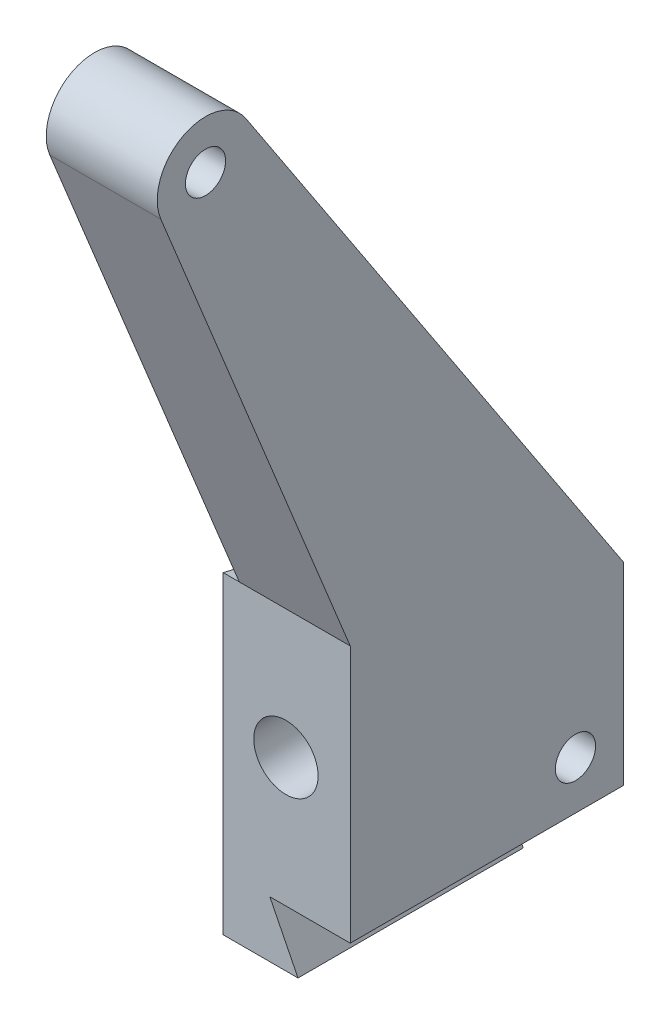
ISO-10303-21;
HEADER;
FILE_DESCRIPTION(('STEP AP214'),'2;1');
FILE_NAME('part.step','',(''),(''),'','','');
FILE_SCHEMA(('AUTOMOTIVE_DESIGN { 1 0 10303 214 1 1 1 1 }'));
ENDSEC;
DATA;
#1=APPLICATION_CONTEXT('core data for automotive mechanical design processes');
#2=APPLICATION_PROTOCOL_DEFINITION('international standard','automotive_design',2000,#1);
#3=PRODUCT_CONTEXT('',#1,'mechanical');
#4=PRODUCT('Part','Part','',(#3));
#5=PRODUCT_RELATED_PRODUCT_CATEGORY('part','',(#4));
#6=PRODUCT_DEFINITION_FORMATION('','',#4);
#7=PRODUCT_DEFINITION_CONTEXT('part definition',#1,'design');
#8=PRODUCT_DEFINITION('design','',#6,#7);
#9=PRODUCT_DEFINITION_SHAPE('','',#8);
#10=(LENGTH_UNIT() NAMED_UNIT(*) SI_UNIT(.MILLI.,.METRE.));
#11=(NAMED_UNIT(*) PLANE_ANGLE_UNIT() SI_UNIT($,.RADIAN.));
#12=(NAMED_UNIT(*) SI_UNIT($,.STERADIAN.) SOLID_ANGLE_UNIT());
#13=UNCERTAINTY_MEASURE_WITH_UNIT(LENGTH_MEASURE(1.E-05),#10,'distance_accuracy_value','');
#14=(GEOMETRIC_REPRESENTATION_CONTEXT(3) GLOBAL_UNCERTAINTY_ASSIGNED_CONTEXT((#13)) GLOBAL_UNIT_ASSIGNED_CONTEXT((#10,
#11,#12)) REPRESENTATION_CONTEXT('',''));
#15=CARTESIAN_POINT('',(0.,0.,0.));
#16=DIRECTION('',(0.,0.,1.));
#17=DIRECTION('',(1.,0.,0.));
#18=AXIS2_PLACEMENT_3D('',#15,#16,#17);
#19=CARTESIAN_POINT('',(7.9,16.,0.));
#20=DIRECTION('',(0.,-0.550279315551789,0.834980643413878));
#21=DIRECTION('',(0.,-0.834980643413878,-0.550279315551789));
#22=AXIS2_PLACEMENT_3D('',#19,#20,#21);
#23=PLANE('',#22);
#24=DIRECTION('',(0.,-0.834980643413878,-0.550279315551789));
#25=VECTOR('',#24,1.);
#26=CARTESIAN_POINT('',(1.,51.6508379466554,23.4950580697584));
#27=LINE('',#26,#25);
#28=CARTESIAN_POINT('',(1.,51.6508379466554,23.4950580697584));
#29=VERTEX_POINT('',#28);
#30=CARTESIAN_POINT('',(1.,16.,0.));
#31=VERTEX_POINT('',#30);
#32=EDGE_CURVE('E123',#29,#31,#27,.T.);
#33=ORIENTED_EDGE('',*,*,#32,.F.);
#34=DIRECTION('',(-1.,0.,0.));
#35=VECTOR('',#34,1.);
#36=CARTESIAN_POINT('',(7.9,51.6508379466554,23.4950580697584));
#37=LINE('',#36,#35);
#38=CARTESIAN_POINT('',(7.9,51.6508379466554,23.4950580697584));
#39=VERTEX_POINT('',#38);
#40=EDGE_CURVE('E145',#39,#29,#37,.T.);
#41=ORIENTED_EDGE('',*,*,#40,.F.);
#42=DIRECTION('',(0.,0.834980643413878,0.550279315551789));
#43=VECTOR('',#42,1.);
#44=CARTESIAN_POINT('',(7.9,16.,0.));
#45=LINE('',#44,#43);
#46=CARTESIAN_POINT('',(7.9,16.,0.));
#47=VERTEX_POINT('',#46);
#48=EDGE_CURVE('E144',#47,#39,#45,.T.);
#49=ORIENTED_EDGE('',*,*,#48,.F.);
#50=DIRECTION('',(-1.,0.,0.));
#51=VECTOR('',#50,1.);
#52=CARTESIAN_POINT('',(7.9,16.,0.));
#53=LINE('',#52,#51);
#54=EDGE_CURVE('E139',#47,#31,#53,.T.);
#55=ORIENTED_EDGE('',*,*,#54,.T.);
#56=EDGE_LOOP('',(#33,#41,#49,#55));
#57=FACE_BOUND('',#56,.T.);
#58=ADVANCED_FACE('F33',(#57),#23,.F.);
#59=CARTESIAN_POINT('',(7.9,50.,26.));
#60=DIRECTION('',(-1.,0.,0.));
#61=DIRECTION('',(0.,0.,1.));
#62=AXIS2_PLACEMENT_3D('',#59,#60,#61);
#63=CYLINDRICAL_SURFACE('',#62,3.);
#64=CARTESIAN_POINT('',(1.,50.,26.));
#65=DIRECTION('',(-1.,0.,0.));
#66=DIRECTION('',(0.,0.,1.));
#67=AXIS2_PLACEMENT_3D('',#64,#65,#66);
#68=CIRCLE('',#67,3.);
#69=CARTESIAN_POINT('',(1.,48.8666904256081,28.7776985813064));
#70=VERTEX_POINT('',#69);
#71=EDGE_CURVE('E128',#70,#29,#68,.T.);
#72=ORIENTED_EDGE('',*,*,#71,.F.);
#73=DIRECTION('',(-1.,0.,0.));
#74=VECTOR('',#73,1.);
#75=CARTESIAN_POINT('',(7.9,48.8666904256081,28.7776985813064));
#76=LINE('',#75,#74);
#77=CARTESIAN_POINT('',(7.9,48.8666904256081,28.7776985813064));
#78=VERTEX_POINT('',#77);
#79=EDGE_CURVE('E148',#78,#70,#76,.T.);
#80=ORIENTED_EDGE('',*,*,#79,.F.);
#81=CARTESIAN_POINT('',(7.9,50.,26.));
#82=DIRECTION('',(1.,0.,0.));
#83=DIRECTION('',(0.,0.,-1.));
#84=AXIS2_PLACEMENT_3D('',#81,#82,#83);
#85=CIRCLE('',#84,3.);
#86=EDGE_CURVE('E172',#39,#78,#85,.T.);
#87=ORIENTED_EDGE('',*,*,#86,.F.);
#88=ORIENTED_EDGE('',*,*,#40,.T.);
#89=EDGE_LOOP('',(#72,#80,#87,#88));
#90=FACE_BOUND('',#89,.T.);
#91=ADVANCED_FACE('F186',(#90),#63,.T.);
#92=CARTESIAN_POINT('',(7.9,20.,17.));
#93=DIRECTION('',(0.,0.37776985813064,-0.925899527102134));
#94=DIRECTION('',(0.,0.925899527102134,0.37776985813064));
#95=AXIS2_PLACEMENT_3D('',#92,#93,#94);
#96=PLANE('',#95);
#97=DIRECTION('',(0.,0.925899527102134,0.37776985813064));
#98=VECTOR('',#97,1.);
#99=CARTESIAN_POINT('',(1.,20.,17.));
#100=LINE('',#99,#98);
#101=CARTESIAN_POINT('',(1.,20.,17.));
#102=VERTEX_POINT('',#101);
#103=EDGE_CURVE('E122',#102,#70,#100,.T.);
#104=ORIENTED_EDGE('',*,*,#103,.F.);
#105=DIRECTION('',(-1.,0.,0.));
#106=VECTOR('',#105,1.);
#107=CARTESIAN_POINT('',(7.9,20.,17.));
#108=LINE('',#107,#106);
#109=CARTESIAN_POINT('',(7.9,20.,17.));
#110=VERTEX_POINT('',#109);
#111=EDGE_CURVE('E169',#110,#102,#108,.T.);
#112=ORIENTED_EDGE('',*,*,#111,.F.);
#113=DIRECTION('',(0.,-0.925899527102134,-0.37776985813064));
#114=VECTOR('',#113,1.);
#115=CARTESIAN_POINT('',(7.9,20.,17.));
#116=LINE('',#115,#114);
#117=EDGE_CURVE('E167',#78,#110,#116,.T.);
#118=ORIENTED_EDGE('',*,*,#117,.F.);
#119=ORIENTED_EDGE('',*,*,#79,.T.);
#120=EDGE_LOOP('',(#104,#112,#118,#119));
#121=FACE_BOUND('',#120,.T.);
#122=ADVANCED_FACE('F183',(#121),#96,.F.);
#123=CARTESIAN_POINT('',(7.9,50.,26.));
#124=DIRECTION('',(-1.,0.,0.));
#125=DIRECTION('',(0.,0.,1.));
#126=AXIS2_PLACEMENT_3D('',#123,#124,#125);
#127=CYLINDRICAL_SURFACE('',#126,1.25);
#128=CARTESIAN_POINT('',(7.9,50.,26.));
#129=DIRECTION('',(1.,0.,0.));
#130=DIRECTION('',(0.,0.,-1.));
#131=AXIS2_PLACEMENT_3D('',#128,#129,#130);
#132=CIRCLE('',#131,1.25);
#133=CARTESIAN_POINT('',(7.9,50.,24.75));
#134=VERTEX_POINT('',#133);
#135=EDGE_CURVE('E178',#134,#134,#132,.T.);
#136=ORIENTED_EDGE('',*,*,#135,.T.);
#137=EDGE_LOOP('',(#136));
#138=FACE_BOUND('',#137,.T.);
#139=CARTESIAN_POINT('',(1.,50.,26.));
#140=DIRECTION('',(-1.,0.,0.));
#141=DIRECTION('',(0.,0.,1.));
#142=AXIS2_PLACEMENT_3D('',#139,#140,#141);
#143=CIRCLE('',#142,1.25);
#144=CARTESIAN_POINT('',(1.,50.,27.25));
#145=VERTEX_POINT('',#144);
#146=EDGE_CURVE('E37',#145,#145,#143,.T.);
#147=ORIENTED_EDGE('',*,*,#146,.T.);
#148=EDGE_LOOP('',(#147));
#149=FACE_BOUND('',#148,.T.);
#150=ADVANCED_FACE('F259',(#138,#149),#127,.F.);
#151=CARTESIAN_POINT('',(4.9,0.,29.));
#152=DIRECTION('',(-0.894427190999916,-0.447213595499958,0.));
#153=DIRECTION('',(0.447213595499958,-0.894427190999916,0.));
#154=AXIS2_PLACEMENT_3D('',#151,#152,#153);
#155=PLANE('',#154);
#156=DIRECTION('',(0.447213595499958,-0.894427190999916,0.));
#157=VECTOR('',#156,1.);
#158=CARTESIAN_POINT('',(4.65,0.5,3.));
#159=LINE('',#158,#157);
#160=CARTESIAN_POINT('',(2.9,4.,3.));
#161=VERTEX_POINT('',#160);
#162=CARTESIAN_POINT('',(4.65,0.499999999999999,3.));
#163=VERTEX_POINT('',#162);
#164=EDGE_CURVE('E49',#161,#163,#159,.T.);
#165=ORIENTED_EDGE('',*,*,#164,.F.);
#166=DIRECTION('',(0.,0.,-1.));
#167=VECTOR('',#166,1.);
#168=CARTESIAN_POINT('',(2.9,4.,29.));
#169=LINE('',#168,#167);
#170=CARTESIAN_POINT('',(2.9,4.,17.));
#171=VERTEX_POINT('',#170);
#172=EDGE_CURVE('E222',#171,#161,#169,.T.);
#173=ORIENTED_EDGE('',*,*,#172,.F.);
#174=DIRECTION('',(-0.447213595499958,0.894427190999916,0.));
#175=VECTOR('',#174,1.);
#176=CARTESIAN_POINT('',(-2.5,14.8,17.));
#177=LINE('',#176,#175);
#178=CARTESIAN_POINT('',(4.65,0.499999999999999,17.));
#179=VERTEX_POINT('',#178);
#180=EDGE_CURVE('E57',#179,#171,#177,.T.);
#181=ORIENTED_EDGE('',*,*,#180,.F.);
#182=DIRECTION('',(0.,0.,-1.));
#183=VECTOR('',#182,1.);
#184=CARTESIAN_POINT('',(4.65,0.499999999999999,29.));
#185=LINE('',#184,#183);
#186=EDGE_CURVE('E11',#179,#163,#185,.T.);
#187=ORIENTED_EDGE('',*,*,#186,.T.);
#188=EDGE_LOOP('',(#165,#173,#181,#187));
#189=FACE_BOUND('',#188,.T.);
#190=ADVANCED_FACE('F237',(#189),#155,.F.);
#191=CARTESIAN_POINT('',(0.,0.5,29.));
#192=DIRECTION('',(0.,1.,0.));
#193=DIRECTION('',(-1.,0.,0.));
#194=AXIS2_PLACEMENT_3D('',#191,#192,#193);
#195=PLANE('',#194);
#196=DIRECTION('',(-1.,0.,0.));
#197=VECTOR('',#196,1.);
#198=CARTESIAN_POINT('',(0.,0.5,3.));
#199=LINE('',#198,#197);
#200=CARTESIAN_POINT('',(0.,0.5,3.));
#201=VERTEX_POINT('',#200);
#202=EDGE_CURVE('E192',#163,#201,#199,.T.);
#203=ORIENTED_EDGE('',*,*,#202,.F.);
#204=ORIENTED_EDGE('',*,*,#186,.F.);
#205=DIRECTION('',(1.,0.,0.));
#206=VECTOR('',#205,1.);
#207=CARTESIAN_POINT('',(7.9,0.5,17.));
#208=LINE('',#207,#206);
#209=CARTESIAN_POINT('',(0.,0.5,17.));
#210=VERTEX_POINT('',#209);
#211=EDGE_CURVE('E212',#210,#179,#208,.T.);
#212=ORIENTED_EDGE('',*,*,#211,.F.);
#213=DIRECTION('',(0.,0.,-1.));
#214=VECTOR('',#213,1.);
#215=CARTESIAN_POINT('',(0.,0.5,29.));
#216=LINE('',#215,#214);
#217=EDGE_CURVE('E207',#210,#201,#216,.T.);
#218=ORIENTED_EDGE('',*,*,#217,.T.);
#219=EDGE_LOOP('',(#203,#204,#212,#218));
#220=FACE_BOUND('',#219,.T.);
#221=ADVANCED_FACE('F238',(#220),#195,.F.);
#222=CARTESIAN_POINT('',(7.9,50.,26.));
#223=DIRECTION('',(1.,0.,0.));
#224=DIRECTION('',(0.,0.,-1.));
#225=AXIS2_PLACEMENT_3D('',#222,#223,#224);
#226=PLANE('',#225);
#227=CARTESIAN_POINT('',(7.9,7.,3.));
#228=DIRECTION('',(1.,0.,0.));
#229=DIRECTION('',(0.,0.,-1.));
#230=AXIS2_PLACEMENT_3D('',#227,#228,#229);
#231=CIRCLE('',#230,1.24999999999999);
#232=CARTESIAN_POINT('',(7.9,7.,1.75000000000001));
#233=VERTEX_POINT('',#232);
#234=EDGE_CURVE('E214',#233,#233,#231,.T.);
#235=ORIENTED_EDGE('',*,*,#234,.F.);
#236=EDGE_LOOP('',(#235));
#237=FACE_BOUND('',#236,.T.);
#238=DIRECTION('',(0.,0.,-1.));
#239=VECTOR('',#238,1.);
#240=CARTESIAN_POINT('',(7.9,4.,29.));
#241=LINE('',#240,#239);
#242=CARTESIAN_POINT('',(7.9,4.,17.));
#243=VERTEX_POINT('',#242);
#244=CARTESIAN_POINT('',(7.9,4.,0.));
#245=VERTEX_POINT('',#244);
#246=EDGE_CURVE('E165',#243,#245,#241,.T.);
#247=ORIENTED_EDGE('',*,*,#246,.T.);
#248=DIRECTION('',(0.,1.,0.));
#249=VECTOR('',#248,1.);
#250=CARTESIAN_POINT('',(7.9,0.,0.));
#251=LINE('',#250,#249);
#252=EDGE_CURVE('E179',#245,#47,#251,.T.);
#253=ORIENTED_EDGE('',*,*,#252,.T.);
#254=ORIENTED_EDGE('',*,*,#48,.T.);
#255=ORIENTED_EDGE('',*,*,#86,.T.);
#256=ORIENTED_EDGE('',*,*,#117,.T.);
#257=DIRECTION('',(0.,-1.,0.));
#258=VECTOR('',#257,1.);
#259=CARTESIAN_POINT('',(7.9,20.,17.));
#260=LINE('',#259,#258);
#261=EDGE_CURVE('E158',#110,#243,#260,.T.);
#262=ORIENTED_EDGE('',*,*,#261,.T.);
#263=EDGE_LOOP('',(#247,#253,#254,#255,#256,#262));
#264=FACE_BOUND('',#263,.T.);
#265=ORIENTED_EDGE('',*,*,#135,.F.);
#266=EDGE_LOOP('',(#265));
#267=FACE_BOUND('',#266,.T.);
#268=ADVANCED_FACE('F163',(#237,#264,#267),#226,.T.);
#269=CARTESIAN_POINT('',(0.,50.,26.));
#270=DIRECTION('',(1.,0.,0.));
#271=DIRECTION('',(0.,0.,-1.));
#272=AXIS2_PLACEMENT_3D('',#269,#270,#271);
#273=PLANE('',#272);
#274=CARTESIAN_POINT('',(0.,7.,3.));
#275=DIRECTION('',(1.,0.,0.));
#276=DIRECTION('',(0.,0.,-1.));
#277=AXIS2_PLACEMENT_3D('',#274,#275,#276);
#278=CIRCLE('',#277,1.25);
#279=CARTESIAN_POINT('',(0.,7.,1.75));
#280=VERTEX_POINT('',#279);
#281=EDGE_CURVE('E217',#280,#280,#278,.T.);
#282=ORIENTED_EDGE('',*,*,#281,.T.);
#283=EDGE_LOOP('',(#282));
#284=FACE_BOUND('',#283,.T.);
#285=DIRECTION('',(0.,-1.,0.));
#286=VECTOR('',#285,1.);
#287=CARTESIAN_POINT('',(0.,20.,17.));
#288=LINE('',#287,#286);
#289=CARTESIAN_POINT('',(0.,20.,17.));
#290=VERTEX_POINT('',#289);
#291=EDGE_CURVE('E177',#290,#210,#288,.T.);
#292=ORIENTED_EDGE('',*,*,#291,.F.);
#293=DIRECTION('',(0.,0.229039333725547,0.973417168333576));
#294=VECTOR('',#293,1.);
#295=CARTESIAN_POINT('',(0.,16.,0.));
#296=LINE('',#295,#294);
#297=CARTESIAN_POINT('',(0.,16.,0.));
#298=VERTEX_POINT('',#297);
#299=EDGE_CURVE('E133',#298,#290,#296,.T.);
#300=ORIENTED_EDGE('',*,*,#299,.F.);
#301=DIRECTION('',(0.,1.,0.));
#302=VECTOR('',#301,1.);
#303=CARTESIAN_POINT('',(0.,0.,0.));
#304=LINE('',#303,#302);
#305=CARTESIAN_POINT('',(0.,4.,0.));
#306=VERTEX_POINT('',#305);
#307=EDGE_CURVE('E142',#306,#298,#304,.T.);
#308=ORIENTED_EDGE('',*,*,#307,.F.);
#309=DIRECTION('',(0.,0.,-1.));
#310=VECTOR('',#309,1.);
#311=CARTESIAN_POINT('',(0.,4.,3.));
#312=LINE('',#311,#310);
#313=CARTESIAN_POINT('',(0.,4.,3.));
#314=VERTEX_POINT('',#313);
#315=EDGE_CURVE('E200',#314,#306,#312,.T.);
#316=ORIENTED_EDGE('',*,*,#315,.F.);
#317=DIRECTION('',(0.,1.,0.));
#318=VECTOR('',#317,1.);
#319=CARTESIAN_POINT('',(0.,4.,3.));
#320=LINE('',#319,#318);
#321=EDGE_CURVE('E194',#201,#314,#320,.T.);
#322=ORIENTED_EDGE('',*,*,#321,.F.);
#323=ORIENTED_EDGE('',*,*,#217,.F.);
#324=EDGE_LOOP('',(#292,#300,#308,#316,#322,#323));
#325=FACE_BOUND('',#324,.T.);
#326=ADVANCED_FACE('F233',(#284,#325),#273,.F.);
#327=CARTESIAN_POINT('',(7.9,0.,0.));
#328=DIRECTION('',(0.,0.,1.));
#329=DIRECTION('',(1.,0.,0.));
#330=AXIS2_PLACEMENT_3D('',#327,#328,#329);
#331=PLANE('',#330);
#332=CARTESIAN_POINT('',(3.9,12.,0.));
#333=DIRECTION('',(0.,0.,1.));
#334=DIRECTION('',(1.,0.,0.));
#335=AXIS2_PLACEMENT_3D('',#332,#333,#334);
#336=CIRCLE('',#335,2.);
#337=CARTESIAN_POINT('',(5.9,12.,0.));
#338=VERTEX_POINT('',#337);
#339=EDGE_CURVE('E204',#338,#338,#336,.T.);
#340=ORIENTED_EDGE('',*,*,#339,.T.);
#341=EDGE_LOOP('',(#340));
#342=FACE_BOUND('',#341,.T.);
#343=DIRECTION('',(1.,0.,0.));
#344=VECTOR('',#343,1.);
#345=CARTESIAN_POINT('',(2.9,4.,0.));
#346=LINE('',#345,#344);
#347=EDGE_CURVE('E220',#306,#245,#346,.T.);
#348=ORIENTED_EDGE('',*,*,#347,.F.);
#349=ORIENTED_EDGE('',*,*,#307,.T.);
#350=DIRECTION('',(-1.,0.,0.));
#351=VECTOR('',#350,1.);
#352=CARTESIAN_POINT('',(1.,16.,0.));
#353=LINE('',#352,#351);
#354=EDGE_CURVE('E116',#31,#298,#353,.T.);
#355=ORIENTED_EDGE('',*,*,#354,.F.);
#356=ORIENTED_EDGE('',*,*,#54,.F.);
#357=ORIENTED_EDGE('',*,*,#252,.F.);
#358=EDGE_LOOP('',(#348,#349,#355,#356,#357));
#359=FACE_BOUND('',#358,.T.);
#360=ADVANCED_FACE('F35',(#342,#359),#331,.F.);
#361=CARTESIAN_POINT('',(7.9,20.,17.));
#362=DIRECTION('',(0.,0.,-1.));
#363=DIRECTION('',(0.,1.,0.));
#364=AXIS2_PLACEMENT_3D('',#361,#362,#363);
#365=PLANE('',#364);
#366=CARTESIAN_POINT('',(3.9,12.,17.));
#367=DIRECTION('',(0.,0.,1.));
#368=DIRECTION('',(1.,0.,0.));
#369=AXIS2_PLACEMENT_3D('',#366,#367,#368);
#370=CIRCLE('',#369,2.);
#371=CARTESIAN_POINT('',(5.9,12.,17.));
#372=VERTEX_POINT('',#371);
#373=EDGE_CURVE('E203',#372,#372,#370,.T.);
#374=ORIENTED_EDGE('',*,*,#373,.F.);
#375=EDGE_LOOP('',(#374));
#376=FACE_BOUND('',#375,.T.);
#377=ORIENTED_EDGE('',*,*,#291,.T.);
#378=ORIENTED_EDGE('',*,*,#211,.T.);
#379=ORIENTED_EDGE('',*,*,#180,.T.);
#380=DIRECTION('',(1.,0.,0.));
#381=VECTOR('',#380,1.);
#382=CARTESIAN_POINT('',(7.9,4.,17.));
#383=LINE('',#382,#381);
#384=EDGE_CURVE('E42',#171,#243,#383,.T.);
#385=ORIENTED_EDGE('',*,*,#384,.T.);
#386=ORIENTED_EDGE('',*,*,#261,.F.);
#387=ORIENTED_EDGE('',*,*,#111,.T.);
#388=DIRECTION('',(-1.,0.,0.));
#389=VECTOR('',#388,1.);
#390=CARTESIAN_POINT('',(1.,20.,17.));
#391=LINE('',#390,#389);
#392=EDGE_CURVE('E119',#102,#290,#391,.T.);
#393=ORIENTED_EDGE('',*,*,#392,.T.);
#394=EDGE_LOOP('',(#377,#378,#379,#385,#386,#387,#393));
#395=FACE_BOUND('',#394,.T.);
#396=ADVANCED_FACE('F156',(#376,#395),#365,.F.);
#397=CARTESIAN_POINT('',(2.9,4.,29.));
#398=DIRECTION('',(0.,1.,0.));
#399=DIRECTION('',(-1.,0.,0.));
#400=AXIS2_PLACEMENT_3D('',#397,#398,#399);
#401=PLANE('',#400);
#402=ORIENTED_EDGE('',*,*,#172,.T.);
#403=DIRECTION('',(1.,0.,0.));
#404=VECTOR('',#403,1.);
#405=CARTESIAN_POINT('',(2.9,4.,3.));
#406=LINE('',#405,#404);
#407=EDGE_CURVE('E197',#314,#161,#406,.T.);
#408=ORIENTED_EDGE('',*,*,#407,.F.);
#409=ORIENTED_EDGE('',*,*,#315,.T.);
#410=ORIENTED_EDGE('',*,*,#347,.T.);
#411=ORIENTED_EDGE('',*,*,#246,.F.);
#412=ORIENTED_EDGE('',*,*,#384,.F.);
#413=EDGE_LOOP('',(#402,#408,#409,#410,#411,#412));
#414=FACE_BOUND('',#413,.T.);
#415=ADVANCED_FACE('F229',(#414),#401,.F.);
#416=CARTESIAN_POINT('',(7.9,7.,3.));
#417=DIRECTION('',(1.,0.,0.));
#418=DIRECTION('',(0.,0.,-1.));
#419=AXIS2_PLACEMENT_3D('',#416,#417,#418);
#420=CYLINDRICAL_SURFACE('',#419,1.24999999999999);
#421=ORIENTED_EDGE('',*,*,#281,.F.);
#422=EDGE_LOOP('',(#421));
#423=FACE_BOUND('',#422,.T.);
#424=ORIENTED_EDGE('',*,*,#234,.T.);
#425=EDGE_LOOP('',(#424));
#426=FACE_BOUND('',#425,.T.);
#427=ADVANCED_FACE('F248',(#423,#426),#420,.F.);
#428=CARTESIAN_POINT('',(3.9,12.,0.));
#429=DIRECTION('',(0.,0.,1.));
#430=DIRECTION('',(1.,0.,0.));
#431=AXIS2_PLACEMENT_3D('',#428,#429,#430);
#432=CYLINDRICAL_SURFACE('',#431,2.);
#433=ORIENTED_EDGE('',*,*,#339,.F.);
#434=EDGE_LOOP('',(#433));
#435=FACE_BOUND('',#434,.T.);
#436=ORIENTED_EDGE('',*,*,#373,.T.);
#437=EDGE_LOOP('',(#436));
#438=FACE_BOUND('',#437,.T.);
#439=ADVANCED_FACE('F241',(#435,#438),#432,.F.);
#440=CARTESIAN_POINT('',(0.,0.,3.));
#441=DIRECTION('',(0.,0.,-1.));
#442=DIRECTION('',(-1.,0.,0.));
#443=AXIS2_PLACEMENT_3D('',#440,#441,#442);
#444=PLANE('',#443);
#445=ORIENTED_EDGE('',*,*,#202,.T.);
#446=ORIENTED_EDGE('',*,*,#321,.T.);
#447=ORIENTED_EDGE('',*,*,#407,.T.);
#448=ORIENTED_EDGE('',*,*,#164,.T.);
#449=EDGE_LOOP('',(#445,#446,#447,#448));
#450=FACE_BOUND('',#449,.T.);
#451=ADVANCED_FACE('F239',(#450),#444,.T.);
#452=CARTESIAN_POINT('',(1.,16.,0.));
#453=DIRECTION('',(0.,-0.973417168333576,0.229039333725547));
#454=DIRECTION('',(0.,-0.229039333725547,-0.973417168333576));
#455=AXIS2_PLACEMENT_3D('',#452,#453,#454);
#456=PLANE('',#455);
#457=ORIENTED_EDGE('',*,*,#299,.T.);
#458=ORIENTED_EDGE('',*,*,#392,.F.);
#459=DIRECTION('',(0.,0.229039333725547,0.973417168333576));
#460=VECTOR('',#459,1.);
#461=CARTESIAN_POINT('',(1.,16.,0.));
#462=LINE('',#461,#460);
#463=EDGE_CURVE('E112',#31,#102,#462,.T.);
#464=ORIENTED_EDGE('',*,*,#463,.F.);
#465=ORIENTED_EDGE('',*,*,#354,.T.);
#466=EDGE_LOOP('',(#457,#458,#464,#465));
#467=FACE_BOUND('',#466,.T.);
#468=ADVANCED_FACE('F114',(#467),#456,.F.);
#469=CARTESIAN_POINT('',(1.,50.,26.));
#470=DIRECTION('',(-1.,0.,0.));
#471=DIRECTION('',(0.,0.,1.));
#472=AXIS2_PLACEMENT_3D('',#469,#470,#471);
#473=PLANE('',#472);
#474=ORIENTED_EDGE('',*,*,#146,.F.);
#475=EDGE_LOOP('',(#474));
#476=FACE_BOUND('',#475,.T.);
#477=ORIENTED_EDGE('',*,*,#32,.T.);
#478=ORIENTED_EDGE('',*,*,#463,.T.);
#479=ORIENTED_EDGE('',*,*,#103,.T.);
#480=ORIENTED_EDGE('',*,*,#71,.T.);
#481=EDGE_LOOP('',(#477,#478,#479,#480));
#482=FACE_BOUND('',#481,.T.);
#483=ADVANCED_FACE('F126',(#476,#482),#473,.T.);
#484=CLOSED_SHELL('',(#58,#91,#122,#150,#190,#221,#268,#326,#360,#396,#415,#427,#439,#451,#468,#483));
#485=MANIFOLD_SOLID_BREP('B2',#484);
#486=ADVANCED_BREP_SHAPE_REPRESENTATION('',(#18,#485),#14);
#487=SHAPE_DEFINITION_REPRESENTATION(#9,#486);
ENDSEC;
END-ISO-10303-21;
